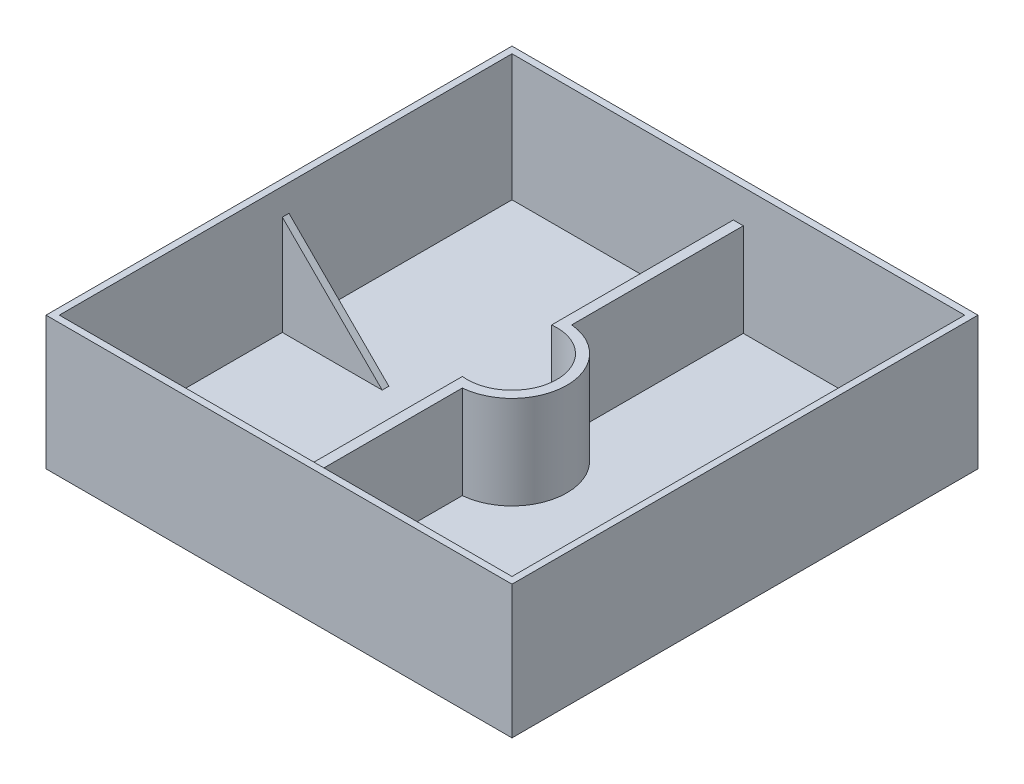
ISO-10303-21;
HEADER;
FILE_DESCRIPTION(('STEP AP214'),'2;1');
FILE_NAME('part.step','',(''),(''),'','','');
FILE_SCHEMA(('AUTOMOTIVE_DESIGN { 1 0 10303 214 1 1 1 1 }'));
ENDSEC;
DATA;
#1=APPLICATION_CONTEXT('core data for automotive mechanical design processes');
#2=APPLICATION_PROTOCOL_DEFINITION('international standard','automotive_design',2000,#1);
#3=PRODUCT_CONTEXT('',#1,'mechanical');
#4=PRODUCT('Part','Part','',(#3));
#5=PRODUCT_RELATED_PRODUCT_CATEGORY('part','',(#4));
#6=PRODUCT_DEFINITION_FORMATION('','',#4);
#7=PRODUCT_DEFINITION_CONTEXT('part definition',#1,'design');
#8=PRODUCT_DEFINITION('design','',#6,#7);
#9=PRODUCT_DEFINITION_SHAPE('','',#8);
#10=(LENGTH_UNIT() NAMED_UNIT(*) SI_UNIT(.MILLI.,.METRE.));
#11=(NAMED_UNIT(*) PLANE_ANGLE_UNIT() SI_UNIT($,.RADIAN.));
#12=(NAMED_UNIT(*) SI_UNIT($,.STERADIAN.) SOLID_ANGLE_UNIT());
#13=UNCERTAINTY_MEASURE_WITH_UNIT(LENGTH_MEASURE(1.E-05),#10,'distance_accuracy_value','');
#14=(GEOMETRIC_REPRESENTATION_CONTEXT(3) GLOBAL_UNCERTAINTY_ASSIGNED_CONTEXT((#13)) GLOBAL_UNIT_ASSIGNED_CONTEXT((#10,
#11,#12)) REPRESENTATION_CONTEXT('',''));
#15=CARTESIAN_POINT('',(0.,0.,0.));
#16=DIRECTION('',(0.,0.,1.));
#17=DIRECTION('',(1.,0.,0.));
#18=AXIS2_PLACEMENT_3D('',#15,#16,#17);
#19=CARTESIAN_POINT('',(0.,2.54,0.));
#20=DIRECTION('',(0.,-1.,0.));
#21=DIRECTION('',(0.,0.,-1.));
#22=AXIS2_PLACEMENT_3D('',#19,#20,#21);
#23=PLANE('',#22);
#24=DIRECTION('',(0.,0.,1.));
#25=VECTOR('',#24,1.);
#26=CARTESIAN_POINT('',(-1.90500000000001,2.54,0.));
#27=LINE('',#26,#25);
#28=CARTESIAN_POINT('',(-1.90500000000001,2.54,-86.36));
#29=VERTEX_POINT('',#28);
#30=CARTESIAN_POINT('',(-1.90500000000001,2.54,-17.0388379885484));
#31=VERTEX_POINT('',#30);
#32=EDGE_CURVE('E339',#29,#31,#27,.T.);
#33=ORIENTED_EDGE('',*,*,#32,.F.);
#34=DIRECTION('',(-1.,0.,0.));
#35=VECTOR('',#34,1.);
#36=CARTESIAN_POINT('',(0.,2.54,-86.36));
#37=LINE('',#36,#35);
#38=CARTESIAN_POINT('',(-86.36,2.54,-86.36));
#39=VERTEX_POINT('',#38);
#40=EDGE_CURVE('E263',#29,#39,#37,.T.);
#41=ORIENTED_EDGE('',*,*,#40,.T.);
#42=DIRECTION('',(0.,0.,1.));
#43=VECTOR('',#42,1.);
#44=CARTESIAN_POINT('',(-86.36,2.54,0.));
#45=LINE('',#44,#43);
#46=CARTESIAN_POINT('',(-86.36,2.54,-1.27));
#47=VERTEX_POINT('',#46);
#48=EDGE_CURVE('E279',#39,#47,#45,.T.);
#49=ORIENTED_EDGE('',*,*,#48,.T.);
#50=DIRECTION('',(-1.,0.,0.));
#51=VECTOR('',#50,1.);
#52=CARTESIAN_POINT('',(0.,2.54,-1.27));
#53=LINE('',#52,#51);
#54=CARTESIAN_POINT('',(-48.26,2.54,-1.27));
#55=VERTEX_POINT('',#54);
#56=EDGE_CURVE('E322',#55,#47,#53,.T.);
#57=ORIENTED_EDGE('',*,*,#56,.F.);
#58=DIRECTION('',(0.,0.,-1.));
#59=VECTOR('',#58,1.);
#60=CARTESIAN_POINT('',(-48.26,2.54,0.));
#61=LINE('',#60,#59);
#62=CARTESIAN_POINT('',(-48.26,2.54,1.27));
#63=VERTEX_POINT('',#62);
#64=EDGE_CURVE('E325',#55,#63,#61,.F.);
#65=ORIENTED_EDGE('',*,*,#64,.T.);
#66=DIRECTION('',(-1.,0.,0.));
#67=VECTOR('',#66,1.);
#68=CARTESIAN_POINT('',(0.,2.54,1.27));
#69=LINE('',#68,#67);
#70=CARTESIAN_POINT('',(-86.36,2.54,1.27));
#71=VERTEX_POINT('',#70);
#72=EDGE_CURVE('E327',#63,#71,#69,.T.);
#73=ORIENTED_EDGE('',*,*,#72,.T.);
#74=CARTESIAN_POINT('',(-86.36,2.54,86.36));
#75=VERTEX_POINT('',#74);
#76=EDGE_CURVE('E276',#71,#75,#45,.T.);
#77=ORIENTED_EDGE('',*,*,#76,.T.);
#78=DIRECTION('',(1.,0.,0.));
#79=VECTOR('',#78,1.);
#80=CARTESIAN_POINT('',(0.,2.54,86.36));
#81=LINE('',#80,#79);
#82=CARTESIAN_POINT('',(-1.90500000000001,2.54,86.36));
#83=VERTEX_POINT('',#82);
#84=EDGE_CURVE('E283',#75,#83,#81,.T.);
#85=ORIENTED_EDGE('',*,*,#84,.T.);
#86=DIRECTION('',(0.,0.,1.));
#87=VECTOR('',#86,1.);
#88=CARTESIAN_POINT('',(-1.90500000000001,2.54,0.));
#89=LINE('',#88,#87);
#90=CARTESIAN_POINT('',(-1.90500000000001,2.54,17.0388379885484));
#91=VERTEX_POINT('',#90);
#92=EDGE_CURVE('E48',#91,#83,#89,.T.);
#93=ORIENTED_EDGE('',*,*,#92,.F.);
#94=CARTESIAN_POINT('',(0.,2.54,0.));
#95=DIRECTION('',(0.,-1.,0.));
#96=DIRECTION('',(0.,0.,-1.));
#97=AXIS2_PLACEMENT_3D('',#94,#95,#96);
#98=CIRCLE('',#97,17.145);
#99=EDGE_CURVE('E337',#31,#91,#98,.T.);
#100=ORIENTED_EDGE('',*,*,#99,.F.);
#101=EDGE_LOOP('',(#33,#41,#49,#57,#65,#73,#77,#85,#93,#100));
#102=FACE_BOUND('',#101,.T.);
#103=ADVANCED_FACE('F33',(#102),#23,.F.);
#104=CARTESIAN_POINT('',(0.,50.8,0.));
#105=DIRECTION('',(0.,-1.,0.));
#106=DIRECTION('',(0.,0.,-1.));
#107=AXIS2_PLACEMENT_3D('',#104,#105,#106);
#108=PLANE('',#107);
#109=DIRECTION('',(0.,0.,-1.));
#110=VECTOR('',#109,1.);
#111=CARTESIAN_POINT('',(88.9,50.8,88.9));
#112=LINE('',#111,#110);
#113=CARTESIAN_POINT('',(88.9,50.8,88.9));
#114=VERTEX_POINT('',#113);
#115=CARTESIAN_POINT('',(88.9,50.8,-88.9));
#116=VERTEX_POINT('',#115);
#117=EDGE_CURVE('E294',#114,#116,#112,.T.);
#118=ORIENTED_EDGE('',*,*,#117,.T.);
#119=DIRECTION('',(-1.,0.,0.));
#120=VECTOR('',#119,1.);
#121=CARTESIAN_POINT('',(-88.9,50.8,-88.9));
#122=LINE('',#121,#120);
#123=CARTESIAN_POINT('',(-88.9,50.8,-88.9));
#124=VERTEX_POINT('',#123);
#125=EDGE_CURVE('E297',#116,#124,#122,.T.);
#126=ORIENTED_EDGE('',*,*,#125,.T.);
#127=DIRECTION('',(0.,0.,1.));
#128=VECTOR('',#127,1.);
#129=CARTESIAN_POINT('',(-88.9,50.8,88.9));
#130=LINE('',#129,#128);
#131=CARTESIAN_POINT('',(-88.9,50.8,88.9));
#132=VERTEX_POINT('',#131);
#133=EDGE_CURVE('E300',#124,#132,#130,.T.);
#134=ORIENTED_EDGE('',*,*,#133,.T.);
#135=DIRECTION('',(1.,0.,0.));
#136=VECTOR('',#135,1.);
#137=CARTESIAN_POINT('',(-88.9,50.8,88.9));
#138=LINE('',#137,#136);
#139=EDGE_CURVE('E302',#132,#114,#138,.T.);
#140=ORIENTED_EDGE('',*,*,#139,.T.);
#141=EDGE_LOOP('',(#118,#126,#134,#140));
#142=FACE_BOUND('',#141,.T.);
#143=DIRECTION('',(0.,0.,-1.));
#144=VECTOR('',#143,1.);
#145=CARTESIAN_POINT('',(86.36,50.8,0.));
#146=LINE('',#145,#144);
#147=CARTESIAN_POINT('',(86.36,50.8,86.36));
#148=VERTEX_POINT('',#147);
#149=CARTESIAN_POINT('',(86.36,50.8,-86.36));
#150=VERTEX_POINT('',#149);
#151=EDGE_CURVE('E286',#148,#150,#146,.T.);
#152=ORIENTED_EDGE('',*,*,#151,.F.);
#153=DIRECTION('',(1.,0.,0.));
#154=VECTOR('',#153,1.);
#155=CARTESIAN_POINT('',(0.,50.8,86.36));
#156=LINE('',#155,#154);
#157=CARTESIAN_POINT('',(-86.36,50.8,86.36));
#158=VERTEX_POINT('',#157);
#159=EDGE_CURVE('E272',#158,#148,#156,.T.);
#160=ORIENTED_EDGE('',*,*,#159,.F.);
#161=DIRECTION('',(0.,0.,1.));
#162=VECTOR('',#161,1.);
#163=CARTESIAN_POINT('',(-86.36,50.8,0.));
#164=LINE('',#163,#162);
#165=CARTESIAN_POINT('',(-86.36,50.8,-86.36));
#166=VERTEX_POINT('',#165);
#167=EDGE_CURVE('E290',#166,#158,#164,.T.);
#168=ORIENTED_EDGE('',*,*,#167,.F.);
#169=DIRECTION('',(-1.,0.,0.));
#170=VECTOR('',#169,1.);
#171=CARTESIAN_POINT('',(0.,50.8,-86.36));
#172=LINE('',#171,#170);
#173=EDGE_CURVE('E288',#150,#166,#172,.T.);
#174=ORIENTED_EDGE('',*,*,#173,.F.);
#175=EDGE_LOOP('',(#152,#160,#168,#174));
#176=FACE_BOUND('',#175,.T.);
#177=ADVANCED_FACE('F384',(#142,#176),#108,.F.);
#178=CARTESIAN_POINT('',(88.9,50.8,88.9));
#179=DIRECTION('',(-1.,0.,0.));
#180=DIRECTION('',(0.,0.,1.));
#181=AXIS2_PLACEMENT_3D('',#178,#179,#180);
#182=PLANE('',#181);
#183=DIRECTION('',(0.,0.,-1.));
#184=VECTOR('',#183,1.);
#185=CARTESIAN_POINT('',(88.9,0.,88.9));
#186=LINE('',#185,#184);
#187=CARTESIAN_POINT('',(88.9,0.,88.9));
#188=VERTEX_POINT('',#187);
#189=CARTESIAN_POINT('',(88.9,0.,-88.9));
#190=VERTEX_POINT('',#189);
#191=EDGE_CURVE('E267',#188,#190,#186,.T.);
#192=ORIENTED_EDGE('',*,*,#191,.T.);
#193=DIRECTION('',(0.,-1.,0.));
#194=VECTOR('',#193,1.);
#195=CARTESIAN_POINT('',(88.9,50.8,-88.9));
#196=LINE('',#195,#194);
#197=EDGE_CURVE('E319',#116,#190,#196,.T.);
#198=ORIENTED_EDGE('',*,*,#197,.F.);
#199=ORIENTED_EDGE('',*,*,#117,.F.);
#200=DIRECTION('',(0.,-1.,0.));
#201=VECTOR('',#200,1.);
#202=CARTESIAN_POINT('',(88.9,50.8,88.9));
#203=LINE('',#202,#201);
#204=EDGE_CURVE('E304',#114,#188,#203,.T.);
#205=ORIENTED_EDGE('',*,*,#204,.T.);
#206=EDGE_LOOP('',(#192,#198,#199,#205));
#207=FACE_BOUND('',#206,.T.);
#208=ADVANCED_FACE('F35',(#207),#182,.F.);
#209=CARTESIAN_POINT('',(-88.9,50.8,-88.9));
#210=DIRECTION('',(0.,0.,1.));
#211=DIRECTION('',(1.,0.,0.));
#212=AXIS2_PLACEMENT_3D('',#209,#210,#211);
#213=PLANE('',#212);
#214=DIRECTION('',(-1.,0.,0.));
#215=VECTOR('',#214,1.);
#216=CARTESIAN_POINT('',(-88.9,0.,-88.9));
#217=LINE('',#216,#215);
#218=CARTESIAN_POINT('',(-88.9,0.,-88.9));
#219=VERTEX_POINT('',#218);
#220=EDGE_CURVE('E306',#190,#219,#217,.T.);
#221=ORIENTED_EDGE('',*,*,#220,.T.);
#222=DIRECTION('',(0.,-1.,0.));
#223=VECTOR('',#222,1.);
#224=CARTESIAN_POINT('',(-88.9,50.8,-88.9));
#225=LINE('',#224,#223);
#226=EDGE_CURVE('E316',#124,#219,#225,.T.);
#227=ORIENTED_EDGE('',*,*,#226,.F.);
#228=ORIENTED_EDGE('',*,*,#125,.F.);
#229=ORIENTED_EDGE('',*,*,#197,.T.);
#230=EDGE_LOOP('',(#221,#227,#228,#229));
#231=FACE_BOUND('',#230,.T.);
#232=ADVANCED_FACE('F445',(#231),#213,.F.);
#233=CARTESIAN_POINT('',(-88.9,50.8,88.9));
#234=DIRECTION('',(1.,0.,0.));
#235=DIRECTION('',(0.,0.,-1.));
#236=AXIS2_PLACEMENT_3D('',#233,#234,#235);
#237=PLANE('',#236);
#238=DIRECTION('',(0.,0.,1.));
#239=VECTOR('',#238,1.);
#240=CARTESIAN_POINT('',(-88.9,0.,88.9));
#241=LINE('',#240,#239);
#242=CARTESIAN_POINT('',(-88.9,0.,88.9));
#243=VERTEX_POINT('',#242);
#244=EDGE_CURVE('E308',#219,#243,#241,.T.);
#245=ORIENTED_EDGE('',*,*,#244,.T.);
#246=DIRECTION('',(0.,-1.,0.));
#247=VECTOR('',#246,1.);
#248=CARTESIAN_POINT('',(-88.9,50.8,88.9));
#249=LINE('',#248,#247);
#250=EDGE_CURVE('E313',#132,#243,#249,.T.);
#251=ORIENTED_EDGE('',*,*,#250,.F.);
#252=ORIENTED_EDGE('',*,*,#133,.F.);
#253=ORIENTED_EDGE('',*,*,#226,.T.);
#254=EDGE_LOOP('',(#245,#251,#252,#253));
#255=FACE_BOUND('',#254,.T.);
#256=ADVANCED_FACE('F439',(#255),#237,.F.);
#257=CARTESIAN_POINT('',(-88.9,50.8,88.9));
#258=DIRECTION('',(0.,0.,-1.));
#259=DIRECTION('',(-1.,0.,0.));
#260=AXIS2_PLACEMENT_3D('',#257,#258,#259);
#261=PLANE('',#260);
#262=DIRECTION('',(1.,0.,0.));
#263=VECTOR('',#262,1.);
#264=CARTESIAN_POINT('',(-88.9,0.,88.9));
#265=LINE('',#264,#263);
#266=EDGE_CURVE('E298',#243,#188,#265,.T.);
#267=ORIENTED_EDGE('',*,*,#266,.T.);
#268=ORIENTED_EDGE('',*,*,#204,.F.);
#269=ORIENTED_EDGE('',*,*,#139,.F.);
#270=ORIENTED_EDGE('',*,*,#250,.T.);
#271=EDGE_LOOP('',(#267,#268,#269,#270));
#272=FACE_BOUND('',#271,.T.);
#273=ADVANCED_FACE('F433',(#272),#261,.F.);
#274=CARTESIAN_POINT('',(0.,0.,0.));
#275=DIRECTION('',(0.,-1.,0.));
#276=DIRECTION('',(0.,0.,-1.));
#277=AXIS2_PLACEMENT_3D('',#274,#275,#276);
#278=PLANE('',#277);
#279=ORIENTED_EDGE('',*,*,#244,.F.);
#280=ORIENTED_EDGE('',*,*,#220,.F.);
#281=ORIENTED_EDGE('',*,*,#191,.F.);
#282=ORIENTED_EDGE('',*,*,#266,.F.);
#283=EDGE_LOOP('',(#279,#280,#281,#282));
#284=FACE_BOUND('',#283,.T.);
#285=ADVANCED_FACE('F429',(#284),#278,.T.);
#286=CARTESIAN_POINT('',(86.36,50.8,88.9));
#287=DIRECTION('',(-1.,0.,0.));
#288=DIRECTION('',(0.,0.,1.));
#289=AXIS2_PLACEMENT_3D('',#286,#287,#288);
#290=PLANE('',#289);
#291=DIRECTION('',(0.,1.,0.));
#292=VECTOR('',#291,1.);
#293=CARTESIAN_POINT('',(86.36,50.8,1.26999999999999));
#294=LINE('',#293,#292);
#295=CARTESIAN_POINT('',(86.36,2.54,1.27));
#296=VERTEX_POINT('',#295);
#297=CARTESIAN_POINT('',(86.36,40.6399999999996,1.26999999999999));
#298=VERTEX_POINT('',#297);
#299=EDGE_CURVE('E241',#296,#298,#294,.T.);
#300=ORIENTED_EDGE('',*,*,#299,.F.);
#301=DIRECTION('',(0.,0.,-1.));
#302=VECTOR('',#301,1.);
#303=CARTESIAN_POINT('',(86.36,2.54,0.));
#304=LINE('',#303,#302);
#305=CARTESIAN_POINT('',(86.36,2.54,86.36));
#306=VERTEX_POINT('',#305);
#307=EDGE_CURVE('E260',#306,#296,#304,.T.);
#308=ORIENTED_EDGE('',*,*,#307,.F.);
#309=DIRECTION('',(0.,-1.,0.));
#310=VECTOR('',#309,1.);
#311=CARTESIAN_POINT('',(86.36,50.8,86.36));
#312=LINE('',#311,#310);
#313=EDGE_CURVE('E269',#148,#306,#312,.T.);
#314=ORIENTED_EDGE('',*,*,#313,.F.);
#315=ORIENTED_EDGE('',*,*,#151,.T.);
#316=DIRECTION('',(0.,-1.,0.));
#317=VECTOR('',#316,1.);
#318=CARTESIAN_POINT('',(86.36,50.8,-86.36));
#319=LINE('',#318,#317);
#320=CARTESIAN_POINT('',(86.36,2.54,-86.36));
#321=VERTEX_POINT('',#320);
#322=EDGE_CURVE('E264',#150,#321,#319,.T.);
#323=ORIENTED_EDGE('',*,*,#322,.T.);
#324=CARTESIAN_POINT('',(86.36,2.54,-1.27));
#325=VERTEX_POINT('',#324);
#326=EDGE_CURVE('E259',#325,#321,#304,.T.);
#327=ORIENTED_EDGE('',*,*,#326,.F.);
#328=DIRECTION('',(0.,1.,0.));
#329=VECTOR('',#328,1.);
#330=CARTESIAN_POINT('',(86.36,50.8,-1.26999999999999));
#331=LINE('',#330,#329);
#332=CARTESIAN_POINT('',(86.36,40.6399999999996,-1.27));
#333=VERTEX_POINT('',#332);
#334=EDGE_CURVE('E237',#325,#333,#331,.T.);
#335=ORIENTED_EDGE('',*,*,#334,.T.);
#336=DIRECTION('',(0.,0.,-1.));
#337=VECTOR('',#336,1.);
#338=CARTESIAN_POINT('',(86.36,40.6399999999996,88.9));
#339=LINE('',#338,#337);
#340=EDGE_CURVE('E56',#298,#333,#339,.T.);
#341=ORIENTED_EDGE('',*,*,#340,.F.);
#342=EDGE_LOOP('',(#300,#308,#314,#315,#323,#327,#335,#341));
#343=FACE_BOUND('',#342,.T.);
#344=ADVANCED_FACE('F382',(#343),#290,.T.);
#345=CARTESIAN_POINT('',(-88.9,50.8,-86.36));
#346=DIRECTION('',(0.,0.,1.));
#347=DIRECTION('',(1.,0.,0.));
#348=AXIS2_PLACEMENT_3D('',#345,#346,#347);
#349=PLANE('',#348);
#350=DIRECTION('',(0.,1.,0.));
#351=VECTOR('',#350,1.);
#352=CARTESIAN_POINT('',(1.90499999999999,38.1,-86.36));
#353=LINE('',#352,#351);
#354=CARTESIAN_POINT('',(1.90499999999999,38.1,-86.36));
#355=VERTEX_POINT('',#354);
#356=CARTESIAN_POINT('',(1.90499999999999,2.54,-86.36));
#357=VERTEX_POINT('',#356);
#358=EDGE_CURVE('E204',#355,#357,#353,.F.);
#359=ORIENTED_EDGE('',*,*,#358,.T.);
#360=EDGE_CURVE('E273',#321,#357,#37,.T.);
#361=ORIENTED_EDGE('',*,*,#360,.F.);
#362=ORIENTED_EDGE('',*,*,#322,.F.);
#363=ORIENTED_EDGE('',*,*,#173,.T.);
#364=DIRECTION('',(0.,-1.,0.));
#365=VECTOR('',#364,1.);
#366=CARTESIAN_POINT('',(-86.36,50.8,-86.36));
#367=LINE('',#366,#365);
#368=EDGE_CURVE('E268',#166,#39,#367,.T.);
#369=ORIENTED_EDGE('',*,*,#368,.T.);
#370=ORIENTED_EDGE('',*,*,#40,.F.);
#371=DIRECTION('',(0.,1.,0.));
#372=VECTOR('',#371,1.);
#373=CARTESIAN_POINT('',(-1.90500000000001,38.1,-86.36));
#374=LINE('',#373,#372);
#375=CARTESIAN_POINT('',(-1.90500000000001,38.1,-86.36));
#376=VERTEX_POINT('',#375);
#377=EDGE_CURVE('E221',#376,#29,#374,.F.);
#378=ORIENTED_EDGE('',*,*,#377,.F.);
#379=DIRECTION('',(-1.,0.,0.));
#380=VECTOR('',#379,1.);
#381=CARTESIAN_POINT('',(-88.9,38.1,-86.36));
#382=LINE('',#381,#380);
#383=EDGE_CURVE('E220',#355,#376,#382,.T.);
#384=ORIENTED_EDGE('',*,*,#383,.F.);
#385=EDGE_LOOP('',(#359,#361,#362,#363,#369,#370,#378,#384));
#386=FACE_BOUND('',#385,.T.);
#387=ADVANCED_FACE('F356',(#386),#349,.T.);
#388=CARTESIAN_POINT('',(-86.36,50.8,88.9));
#389=DIRECTION('',(1.,0.,0.));
#390=DIRECTION('',(0.,0.,-1.));
#391=AXIS2_PLACEMENT_3D('',#388,#389,#390);
#392=PLANE('',#391);
#393=DIRECTION('',(0.,-1.,0.));
#394=VECTOR('',#393,1.);
#395=CARTESIAN_POINT('',(-86.36,50.8,1.26999999999999));
#396=LINE('',#395,#394);
#397=CARTESIAN_POINT('',(-86.36,40.6399999999996,1.26999999999999));
#398=VERTEX_POINT('',#397);
#399=EDGE_CURVE('E253',#398,#71,#396,.T.);
#400=ORIENTED_EDGE('',*,*,#399,.F.);
#401=DIRECTION('',(0.,0.,-1.));
#402=VECTOR('',#401,1.);
#403=CARTESIAN_POINT('',(-86.36,40.6399999999996,88.9));
#404=LINE('',#403,#402);
#405=CARTESIAN_POINT('',(-86.36,40.6399999999996,-1.27));
#406=VERTEX_POINT('',#405);
#407=EDGE_CURVE('E256',#406,#398,#404,.F.);
#408=ORIENTED_EDGE('',*,*,#407,.F.);
#409=DIRECTION('',(0.,-1.,0.));
#410=VECTOR('',#409,1.);
#411=CARTESIAN_POINT('',(-86.36,50.8,-1.26999999999999));
#412=LINE('',#411,#410);
#413=EDGE_CURVE('E248',#406,#47,#412,.T.);
#414=ORIENTED_EDGE('',*,*,#413,.T.);
#415=ORIENTED_EDGE('',*,*,#48,.F.);
#416=ORIENTED_EDGE('',*,*,#368,.F.);
#417=ORIENTED_EDGE('',*,*,#167,.T.);
#418=DIRECTION('',(0.,-1.,0.));
#419=VECTOR('',#418,1.);
#420=CARTESIAN_POINT('',(-86.36,50.8,86.36));
#421=LINE('',#420,#419);
#422=EDGE_CURVE('E271',#158,#75,#421,.T.);
#423=ORIENTED_EDGE('',*,*,#422,.T.);
#424=ORIENTED_EDGE('',*,*,#76,.F.);
#425=EDGE_LOOP('',(#400,#408,#414,#415,#416,#417,#423,#424));
#426=FACE_BOUND('',#425,.T.);
#427=ADVANCED_FACE('F374',(#426),#392,.T.);
#428=CARTESIAN_POINT('',(-88.9,50.8,86.36));
#429=DIRECTION('',(0.,0.,-1.));
#430=DIRECTION('',(-1.,0.,0.));
#431=AXIS2_PLACEMENT_3D('',#428,#429,#430);
#432=PLANE('',#431);
#433=DIRECTION('',(0.,1.,0.));
#434=VECTOR('',#433,1.);
#435=CARTESIAN_POINT('',(1.90499999999999,38.1,86.36));
#436=LINE('',#435,#434);
#437=CARTESIAN_POINT('',(1.90499999999999,38.1,86.36));
#438=VERTEX_POINT('',#437);
#439=CARTESIAN_POINT('',(1.90499999999999,2.54,86.36));
#440=VERTEX_POINT('',#439);
#441=EDGE_CURVE('E194',#438,#440,#436,.F.);
#442=ORIENTED_EDGE('',*,*,#441,.F.);
#443=DIRECTION('',(1.,0.,0.));
#444=VECTOR('',#443,1.);
#445=CARTESIAN_POINT('',(-88.9,38.1,86.36));
#446=LINE('',#445,#444);
#447=CARTESIAN_POINT('',(-1.90500000000001,38.1,86.36));
#448=VERTEX_POINT('',#447);
#449=EDGE_CURVE('E11',#448,#438,#446,.T.);
#450=ORIENTED_EDGE('',*,*,#449,.F.);
#451=DIRECTION('',(0.,1.,0.));
#452=VECTOR('',#451,1.);
#453=CARTESIAN_POINT('',(-1.90500000000001,38.1,86.36));
#454=LINE('',#453,#452);
#455=EDGE_CURVE('E224',#448,#83,#454,.F.);
#456=ORIENTED_EDGE('',*,*,#455,.T.);
#457=ORIENTED_EDGE('',*,*,#84,.F.);
#458=ORIENTED_EDGE('',*,*,#422,.F.);
#459=ORIENTED_EDGE('',*,*,#159,.T.);
#460=ORIENTED_EDGE('',*,*,#313,.T.);
#461=EDGE_CURVE('E203',#440,#306,#81,.T.);
#462=ORIENTED_EDGE('',*,*,#461,.F.);
#463=EDGE_LOOP('',(#442,#450,#456,#457,#458,#459,#460,#462));
#464=FACE_BOUND('',#463,.T.);
#465=ADVANCED_FACE('F201',(#464),#432,.T.);
#466=ORIENTED_EDGE('',*,*,#360,.T.);
#467=DIRECTION('',(0.,0.,1.));
#468=VECTOR('',#467,1.);
#469=CARTESIAN_POINT('',(1.90499999999999,2.54,0.));
#470=LINE('',#469,#468);
#471=CARTESIAN_POINT('',(1.90499999999999,2.54,-20.8682294409468));
#472=VERTEX_POINT('',#471);
#473=EDGE_CURVE('E41',#357,#472,#470,.T.);
#474=ORIENTED_EDGE('',*,*,#473,.T.);
#475=CARTESIAN_POINT('',(0.,2.54,0.));
#476=DIRECTION('',(0.,-1.,0.));
#477=DIRECTION('',(0.,0.,-1.));
#478=AXIS2_PLACEMENT_3D('',#475,#476,#477);
#479=CIRCLE('',#478,20.955);
#480=CARTESIAN_POINT('',(1.90499999999999,2.54,20.8682294409468));
#481=VERTEX_POINT('',#480);
#482=EDGE_CURVE('E343',#472,#481,#479,.T.);
#483=ORIENTED_EDGE('',*,*,#482,.T.);
#484=DIRECTION('',(0.,0.,1.));
#485=VECTOR('',#484,1.);
#486=CARTESIAN_POINT('',(1.90499999999999,2.54,0.));
#487=LINE('',#486,#485);
#488=EDGE_CURVE('E341',#481,#440,#487,.T.);
#489=ORIENTED_EDGE('',*,*,#488,.T.);
#490=ORIENTED_EDGE('',*,*,#461,.T.);
#491=ORIENTED_EDGE('',*,*,#307,.T.);
#492=DIRECTION('',(-1.,0.,0.));
#493=VECTOR('',#492,1.);
#494=CARTESIAN_POINT('',(0.,2.54,1.27));
#495=LINE('',#494,#493);
#496=CARTESIAN_POINT('',(48.26,2.54,1.27));
#497=VERTEX_POINT('',#496);
#498=EDGE_CURVE('E334',#296,#497,#495,.T.);
#499=ORIENTED_EDGE('',*,*,#498,.T.);
#500=DIRECTION('',(0.,0.,-1.));
#501=VECTOR('',#500,1.);
#502=CARTESIAN_POINT('',(48.26,2.54,0.));
#503=LINE('',#502,#501);
#504=CARTESIAN_POINT('',(48.26,2.54,-1.27));
#505=VERTEX_POINT('',#504);
#506=EDGE_CURVE('E332',#497,#505,#503,.T.);
#507=ORIENTED_EDGE('',*,*,#506,.T.);
#508=DIRECTION('',(-1.,0.,0.));
#509=VECTOR('',#508,1.);
#510=CARTESIAN_POINT('',(0.,2.54,-1.27));
#511=LINE('',#510,#509);
#512=EDGE_CURVE('E329',#325,#505,#511,.T.);
#513=ORIENTED_EDGE('',*,*,#512,.F.);
#514=ORIENTED_EDGE('',*,*,#326,.T.);
#515=EDGE_LOOP('',(#466,#474,#483,#489,#490,#491,#499,#507,#513,#514));
#516=FACE_BOUND('',#515,.T.);
#517=ADVANCED_FACE('F347',(#516),#23,.F.);
#518=CARTESIAN_POINT('',(-86.36,40.6399999999996,0.));
#519=DIRECTION('',(-0.707106781186544,-0.707106781186551,0.));
#520=DIRECTION('',(0.707106781186551,-0.707106781186544,0.));
#521=AXIS2_PLACEMENT_3D('',#518,#519,#520);
#522=PLANE('',#521);
#523=DIRECTION('',(0.707106781186551,-0.707106781186544,0.));
#524=VECTOR('',#523,1.);
#525=CARTESIAN_POINT('',(-86.36,40.6399999999996,-1.27));
#526=LINE('',#525,#524);
#527=EDGE_CURVE('E244',#406,#55,#526,.T.);
#528=ORIENTED_EDGE('',*,*,#527,.F.);
#529=ORIENTED_EDGE('',*,*,#407,.T.);
#530=DIRECTION('',(0.707106781186551,-0.707106781186544,0.));
#531=VECTOR('',#530,1.);
#532=CARTESIAN_POINT('',(-86.36,40.6399999999996,1.27));
#533=LINE('',#532,#531);
#534=EDGE_CURVE('E245',#398,#63,#533,.T.);
#535=ORIENTED_EDGE('',*,*,#534,.T.);
#536=ORIENTED_EDGE('',*,*,#64,.F.);
#537=EDGE_LOOP('',(#528,#529,#535,#536));
#538=FACE_BOUND('',#537,.T.);
#539=ADVANCED_FACE('F391',(#538),#522,.F.);
#540=CARTESIAN_POINT('',(0.,25.4,1.27));
#541=DIRECTION('',(0.,0.,1.));
#542=DIRECTION('',(1.,0.,0.));
#543=AXIS2_PLACEMENT_3D('',#540,#541,#542);
#544=PLANE('',#543);
#545=ORIENTED_EDGE('',*,*,#534,.F.);
#546=ORIENTED_EDGE('',*,*,#399,.T.);
#547=ORIENTED_EDGE('',*,*,#72,.F.);
#548=EDGE_LOOP('',(#545,#546,#547));
#549=FACE_BOUND('',#548,.T.);
#550=ADVANCED_FACE('F396',(#549),#544,.T.);
#551=CARTESIAN_POINT('',(0.,25.4,-1.27));
#552=DIRECTION('',(0.,0.,1.));
#553=DIRECTION('',(1.,0.,0.));
#554=AXIS2_PLACEMENT_3D('',#551,#552,#553);
#555=PLANE('',#554);
#556=ORIENTED_EDGE('',*,*,#413,.F.);
#557=ORIENTED_EDGE('',*,*,#527,.T.);
#558=ORIENTED_EDGE('',*,*,#56,.T.);
#559=EDGE_LOOP('',(#556,#557,#558));
#560=FACE_BOUND('',#559,.T.);
#561=ADVANCED_FACE('F393',(#560),#555,.F.);
#562=CARTESIAN_POINT('',(86.36,40.6399999999996,0.));
#563=DIRECTION('',(-0.707106781186544,0.707106781186551,0.));
#564=DIRECTION('',(-0.707106781186551,-0.707106781186544,0.));
#565=AXIS2_PLACEMENT_3D('',#562,#563,#564);
#566=PLANE('',#565);
#567=DIRECTION('',(-0.707106781186551,-0.707106781186544,0.));
#568=VECTOR('',#567,1.);
#569=CARTESIAN_POINT('',(86.36,40.6399999999996,1.27));
#570=LINE('',#569,#568);
#571=EDGE_CURVE('E234',#298,#497,#570,.T.);
#572=ORIENTED_EDGE('',*,*,#571,.F.);
#573=ORIENTED_EDGE('',*,*,#340,.T.);
#574=DIRECTION('',(-0.707106781186551,-0.707106781186544,0.));
#575=VECTOR('',#574,1.);
#576=CARTESIAN_POINT('',(86.36,40.6399999999996,-1.27));
#577=LINE('',#576,#575);
#578=EDGE_CURVE('E233',#333,#505,#577,.T.);
#579=ORIENTED_EDGE('',*,*,#578,.T.);
#580=ORIENTED_EDGE('',*,*,#506,.F.);
#581=EDGE_LOOP('',(#572,#573,#579,#580));
#582=FACE_BOUND('',#581,.T.);
#583=ADVANCED_FACE('F395',(#582),#566,.T.);
#584=CARTESIAN_POINT('',(0.,25.4,1.27));
#585=DIRECTION('',(0.,0.,1.));
#586=DIRECTION('',(1.,0.,0.));
#587=AXIS2_PLACEMENT_3D('',#584,#585,#586);
#588=PLANE('',#587);
#589=ORIENTED_EDGE('',*,*,#498,.F.);
#590=ORIENTED_EDGE('',*,*,#299,.T.);
#591=ORIENTED_EDGE('',*,*,#571,.T.);
#592=EDGE_LOOP('',(#589,#590,#591));
#593=FACE_BOUND('',#592,.T.);
#594=ADVANCED_FACE('F402',(#593),#588,.T.);
#595=CARTESIAN_POINT('',(0.,25.4,-1.27));
#596=DIRECTION('',(0.,0.,1.));
#597=DIRECTION('',(1.,0.,0.));
#598=AXIS2_PLACEMENT_3D('',#595,#596,#597);
#599=PLANE('',#598);
#600=ORIENTED_EDGE('',*,*,#334,.F.);
#601=ORIENTED_EDGE('',*,*,#512,.T.);
#602=ORIENTED_EDGE('',*,*,#578,.F.);
#603=EDGE_LOOP('',(#600,#601,#602));
#604=FACE_BOUND('',#603,.T.);
#605=ADVANCED_FACE('F519',(#604),#599,.F.);
#606=CARTESIAN_POINT('',(1.90499999999999,38.1,-86.36));
#607=DIRECTION('',(1.,0.,0.));
#608=DIRECTION('',(0.,0.,-1.));
#609=AXIS2_PLACEMENT_3D('',#606,#607,#608);
#610=PLANE('',#609);
#611=ORIENTED_EDGE('',*,*,#473,.F.);
#612=ORIENTED_EDGE('',*,*,#358,.F.);
#613=DIRECTION('',(0.,0.,-1.));
#614=VECTOR('',#613,1.);
#615=CARTESIAN_POINT('',(1.90499999999999,38.1,-86.36));
#616=LINE('',#615,#614);
#617=CARTESIAN_POINT('',(1.90499999999999,38.1,-20.8682294409468));
#618=VERTEX_POINT('',#617);
#619=EDGE_CURVE('E217',#355,#618,#616,.F.);
#620=ORIENTED_EDGE('',*,*,#619,.T.);
#621=DIRECTION('',(0.,-1.,0.));
#622=VECTOR('',#621,1.);
#623=CARTESIAN_POINT('',(1.90499999999999,38.1,-20.8682294409468));
#624=LINE('',#623,#622);
#625=EDGE_CURVE('E198',#618,#472,#624,.T.);
#626=ORIENTED_EDGE('',*,*,#625,.T.);
#627=EDGE_LOOP('',(#611,#612,#620,#626));
#628=FACE_BOUND('',#627,.T.);
#629=ADVANCED_FACE('F352',(#628),#610,.T.);
#630=CARTESIAN_POINT('',(0.,38.1,0.));
#631=DIRECTION('',(0.,-1.,0.));
#632=DIRECTION('',(0.,0.,-1.));
#633=AXIS2_PLACEMENT_3D('',#630,#631,#632);
#634=CYLINDRICAL_SURFACE('',#633,20.955);
#635=ORIENTED_EDGE('',*,*,#482,.F.);
#636=ORIENTED_EDGE('',*,*,#625,.F.);
#637=CARTESIAN_POINT('',(0.,38.1,0.));
#638=DIRECTION('',(0.,-1.,0.));
#639=DIRECTION('',(0.,0.,-1.));
#640=AXIS2_PLACEMENT_3D('',#637,#638,#639);
#641=CIRCLE('',#640,20.955);
#642=CARTESIAN_POINT('',(1.90499999999999,38.1,20.8682294409468));
#643=VERTEX_POINT('',#642);
#644=EDGE_CURVE('E215',#618,#643,#641,.T.);
#645=ORIENTED_EDGE('',*,*,#644,.T.);
#646=DIRECTION('',(0.,-1.,0.));
#647=VECTOR('',#646,1.);
#648=CARTESIAN_POINT('',(1.90499999999999,38.1,20.8682294409468));
#649=LINE('',#648,#647);
#650=EDGE_CURVE('E197',#643,#481,#649,.T.);
#651=ORIENTED_EDGE('',*,*,#650,.T.);
#652=EDGE_LOOP('',(#635,#636,#645,#651));
#653=FACE_BOUND('',#652,.T.);
#654=ADVANCED_FACE('F540',(#653),#634,.T.);
#655=CARTESIAN_POINT('',(1.90499999999999,38.1,19.05));
#656=DIRECTION('',(1.,0.,0.));
#657=DIRECTION('',(0.,0.,-1.));
#658=AXIS2_PLACEMENT_3D('',#655,#656,#657);
#659=PLANE('',#658);
#660=ORIENTED_EDGE('',*,*,#488,.F.);
#661=ORIENTED_EDGE('',*,*,#650,.F.);
#662=DIRECTION('',(0.,0.,-1.));
#663=VECTOR('',#662,1.);
#664=CARTESIAN_POINT('',(1.90499999999999,38.1,19.05));
#665=LINE('',#664,#663);
#666=EDGE_CURVE('E185',#643,#438,#665,.F.);
#667=ORIENTED_EDGE('',*,*,#666,.T.);
#668=ORIENTED_EDGE('',*,*,#441,.T.);
#669=EDGE_LOOP('',(#660,#661,#667,#668));
#670=FACE_BOUND('',#669,.T.);
#671=ADVANCED_FACE('F193',(#670),#659,.T.);
#672=CARTESIAN_POINT('',(-1.90500000000001,38.1,-86.36));
#673=DIRECTION('',(1.,0.,0.));
#674=DIRECTION('',(0.,0.,-1.));
#675=AXIS2_PLACEMENT_3D('',#672,#673,#674);
#676=PLANE('',#675);
#677=ORIENTED_EDGE('',*,*,#377,.T.);
#678=ORIENTED_EDGE('',*,*,#32,.T.);
#679=DIRECTION('',(0.,-1.,0.));
#680=VECTOR('',#679,1.);
#681=CARTESIAN_POINT('',(-1.90500000000001,38.1,-17.0388379885484));
#682=LINE('',#681,#680);
#683=CARTESIAN_POINT('',(-1.90500000000001,38.1,-17.0388379885484));
#684=VERTEX_POINT('',#683);
#685=EDGE_CURVE('E225',#684,#31,#682,.T.);
#686=ORIENTED_EDGE('',*,*,#685,.F.);
#687=DIRECTION('',(0.,0.,-1.));
#688=VECTOR('',#687,1.);
#689=CARTESIAN_POINT('',(-1.90500000000001,38.1,-86.36));
#690=LINE('',#689,#688);
#691=EDGE_CURVE('E205',#376,#684,#690,.F.);
#692=ORIENTED_EDGE('',*,*,#691,.F.);
#693=EDGE_LOOP('',(#677,#678,#686,#692));
#694=FACE_BOUND('',#693,.T.);
#695=ADVANCED_FACE('F362',(#694),#676,.F.);
#696=CARTESIAN_POINT('',(0.,38.1,0.));
#697=DIRECTION('',(0.,-1.,0.));
#698=DIRECTION('',(0.,0.,-1.));
#699=AXIS2_PLACEMENT_3D('',#696,#697,#698);
#700=CYLINDRICAL_SURFACE('',#699,17.145);
#701=ORIENTED_EDGE('',*,*,#685,.T.);
#702=ORIENTED_EDGE('',*,*,#99,.T.);
#703=DIRECTION('',(0.,-1.,0.));
#704=VECTOR('',#703,1.);
#705=CARTESIAN_POINT('',(-1.90500000000001,38.1,17.0388379885484));
#706=LINE('',#705,#704);
#707=CARTESIAN_POINT('',(-1.90500000000001,38.1,17.0388379885484));
#708=VERTEX_POINT('',#707);
#709=EDGE_CURVE('E223',#708,#91,#706,.T.);
#710=ORIENTED_EDGE('',*,*,#709,.F.);
#711=CARTESIAN_POINT('',(0.,38.1,0.));
#712=DIRECTION('',(0.,-1.,0.));
#713=DIRECTION('',(0.,0.,-1.));
#714=AXIS2_PLACEMENT_3D('',#711,#712,#713);
#715=CIRCLE('',#714,17.145);
#716=EDGE_CURVE('E210',#684,#708,#715,.T.);
#717=ORIENTED_EDGE('',*,*,#716,.F.);
#718=EDGE_LOOP('',(#701,#702,#710,#717));
#719=FACE_BOUND('',#718,.T.);
#720=ADVANCED_FACE('F367',(#719),#700,.F.);
#721=CARTESIAN_POINT('',(-1.90500000000001,38.1,19.05));
#722=DIRECTION('',(1.,0.,0.));
#723=DIRECTION('',(0.,0.,-1.));
#724=AXIS2_PLACEMENT_3D('',#721,#722,#723);
#725=PLANE('',#724);
#726=ORIENTED_EDGE('',*,*,#709,.T.);
#727=ORIENTED_EDGE('',*,*,#92,.T.);
#728=ORIENTED_EDGE('',*,*,#455,.F.);
#729=DIRECTION('',(0.,0.,-1.));
#730=VECTOR('',#729,1.);
#731=CARTESIAN_POINT('',(-1.90500000000001,38.1,19.05));
#732=LINE('',#731,#730);
#733=EDGE_CURVE('E189',#708,#448,#732,.F.);
#734=ORIENTED_EDGE('',*,*,#733,.F.);
#735=EDGE_LOOP('',(#726,#727,#728,#734));
#736=FACE_BOUND('',#735,.T.);
#737=ADVANCED_FACE('F368',(#736),#725,.F.);
#738=CARTESIAN_POINT('',(0.,38.1,86.36));
#739=DIRECTION('',(0.,1.,0.));
#740=DIRECTION('',(0.,0.,1.));
#741=AXIS2_PLACEMENT_3D('',#738,#739,#740);
#742=PLANE('',#741);
#743=ORIENTED_EDGE('',*,*,#619,.F.);
#744=ORIENTED_EDGE('',*,*,#383,.T.);
#745=ORIENTED_EDGE('',*,*,#691,.T.);
#746=ORIENTED_EDGE('',*,*,#716,.T.);
#747=ORIENTED_EDGE('',*,*,#733,.T.);
#748=ORIENTED_EDGE('',*,*,#449,.T.);
#749=ORIENTED_EDGE('',*,*,#666,.F.);
#750=ORIENTED_EDGE('',*,*,#644,.F.);
#751=EDGE_LOOP('',(#743,#744,#745,#746,#747,#748,#749,#750));
#752=FACE_BOUND('',#751,.T.);
#753=ADVANCED_FACE('F184',(#752),#742,.T.);
#754=CLOSED_SHELL('',(#103,#177,#208,#232,#256,#273,#285,#344,#387,#427,#465,#517,#539,#550,
#561,#583,#594,#605,#629,#654,#671,#695,#720,#737,#753));
#755=MANIFOLD_SOLID_BREP('B2',#754);
#756=ADVANCED_BREP_SHAPE_REPRESENTATION('',(#18,#755),#14);
#757=SHAPE_DEFINITION_REPRESENTATION(#9,#756);
ENDSEC;
END-ISO-10303-21;
